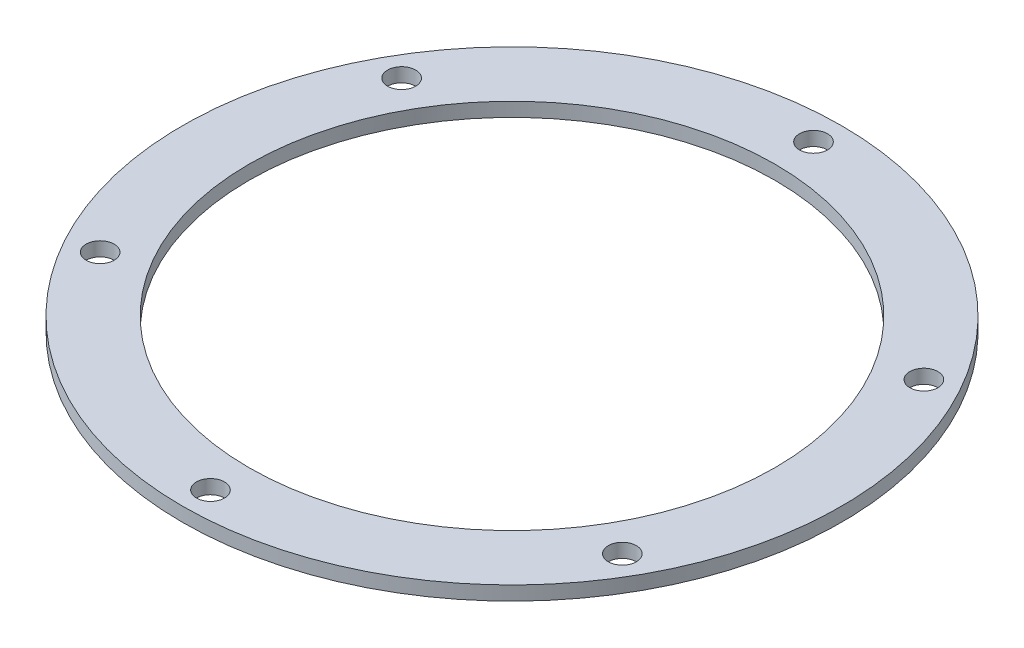
ISO-10303-21;
HEADER;
FILE_DESCRIPTION(('STEP AP214'),'2;1');
FILE_NAME('part.step','',(''),(''),'','','');
FILE_SCHEMA(('AUTOMOTIVE_DESIGN { 1 0 10303 214 1 1 1 1 }'));
ENDSEC;
DATA;
#1=APPLICATION_CONTEXT('core data for automotive mechanical design processes');
#2=APPLICATION_PROTOCOL_DEFINITION('international standard','automotive_design',2000,#1);
#3=PRODUCT_CONTEXT('',#1,'mechanical');
#4=PRODUCT('Part','Part','',(#3));
#5=PRODUCT_RELATED_PRODUCT_CATEGORY('part','',(#4));
#6=PRODUCT_DEFINITION_FORMATION('','',#4);
#7=PRODUCT_DEFINITION_CONTEXT('part definition',#1,'design');
#8=PRODUCT_DEFINITION('design','',#6,#7);
#9=PRODUCT_DEFINITION_SHAPE('','',#8);
#10=(LENGTH_UNIT() NAMED_UNIT(*) SI_UNIT(.MILLI.,.METRE.));
#11=(NAMED_UNIT(*) PLANE_ANGLE_UNIT() SI_UNIT($,.RADIAN.));
#12=(NAMED_UNIT(*) SI_UNIT($,.STERADIAN.) SOLID_ANGLE_UNIT());
#13=UNCERTAINTY_MEASURE_WITH_UNIT(LENGTH_MEASURE(1.E-05),#10,'distance_accuracy_value','');
#14=(GEOMETRIC_REPRESENTATION_CONTEXT(3) GLOBAL_UNCERTAINTY_ASSIGNED_CONTEXT((#13)) GLOBAL_UNIT_ASSIGNED_CONTEXT((#10,
#11,#12)) REPRESENTATION_CONTEXT('',''));
#15=CARTESIAN_POINT('',(0.,0.,0.));
#16=DIRECTION('',(0.,0.,1.));
#17=DIRECTION('',(1.,0.,0.));
#18=AXIS2_PLACEMENT_3D('',#15,#16,#17);
#19=CARTESIAN_POINT('',(0.,2.,0.));
#20=DIRECTION('',(0.,1.,0.));
#21=DIRECTION('',(0.,0.,1.));
#22=AXIS2_PLACEMENT_3D('',#19,#20,#21);
#23=PLANE('',#22);
#24=CARTESIAN_POINT('',(-37.2390923627309,2.,21.5));
#25=DIRECTION('',(0.,1.,0.));
#26=DIRECTION('',(0.,0.,1.));
#27=AXIS2_PLACEMENT_3D('',#24,#25,#26);
#28=CIRCLE('',#27,2.);
#29=CARTESIAN_POINT('',(-37.2390923627309,2.,23.5));
#30=VERTEX_POINT('',#29);
#31=EDGE_CURVE('E80',#30,#30,#28,.T.);
#32=ORIENTED_EDGE('',*,*,#31,.F.);
#33=EDGE_LOOP('',(#32));
#34=FACE_BOUND('',#33,.T.);
#35=CARTESIAN_POINT('',(37.2390923627309,2.,21.5));
#36=DIRECTION('',(0.,1.,0.));
#37=DIRECTION('',(0.,0.,1.));
#38=AXIS2_PLACEMENT_3D('',#35,#36,#37);
#39=CIRCLE('',#38,2.);
#40=CARTESIAN_POINT('',(37.2390923627309,2.,23.5));
#41=VERTEX_POINT('',#40);
#42=EDGE_CURVE('E62',#41,#41,#39,.T.);
#43=ORIENTED_EDGE('',*,*,#42,.F.);
#44=EDGE_LOOP('',(#43));
#45=FACE_BOUND('',#44,.T.);
#46=CARTESIAN_POINT('',(0.,2.,-43.));
#47=DIRECTION('',(0.,1.,0.));
#48=DIRECTION('',(0.,0.,1.));
#49=AXIS2_PLACEMENT_3D('',#46,#47,#48);
#50=CIRCLE('',#49,2.);
#51=CARTESIAN_POINT('',(0.,2.,-41.));
#52=VERTEX_POINT('',#51);
#53=EDGE_CURVE('E52',#52,#52,#50,.T.);
#54=ORIENTED_EDGE('',*,*,#53,.F.);
#55=EDGE_LOOP('',(#54));
#56=FACE_BOUND('',#55,.T.);
#57=CARTESIAN_POINT('',(0.,2.,0.));
#58=DIRECTION('',(0.,1.,0.));
#59=DIRECTION('',(0.,0.,1.));
#60=AXIS2_PLACEMENT_3D('',#57,#58,#59);
#61=CIRCLE('',#60,47.);
#62=CARTESIAN_POINT('',(0.,2.,47.));
#63=VERTEX_POINT('',#62);
#64=EDGE_CURVE('E10',#63,#63,#61,.T.);
#65=ORIENTED_EDGE('',*,*,#64,.T.);
#66=EDGE_LOOP('',(#65));
#67=FACE_BOUND('',#66,.T.);
#68=CARTESIAN_POINT('',(0.,2.,0.));
#69=DIRECTION('',(0.,1.,0.));
#70=DIRECTION('',(0.,0.,1.));
#71=AXIS2_PLACEMENT_3D('',#68,#69,#70);
#72=CIRCLE('',#71,37.5);
#73=CARTESIAN_POINT('',(0.,2.,37.5));
#74=VERTEX_POINT('',#73);
#75=EDGE_CURVE('E48',#74,#74,#72,.T.);
#76=ORIENTED_EDGE('',*,*,#75,.F.);
#77=EDGE_LOOP('',(#76));
#78=FACE_BOUND('',#77,.T.);
#79=CARTESIAN_POINT('',(37.2390923627309,2.,-21.5));
#80=DIRECTION('',(0.,1.,0.));
#81=DIRECTION('',(0.,0.,1.));
#82=AXIS2_PLACEMENT_3D('',#79,#80,#81);
#83=CIRCLE('',#82,2.);
#84=CARTESIAN_POINT('',(37.2390923627309,2.,-19.5));
#85=VERTEX_POINT('',#84);
#86=EDGE_CURVE('E56',#85,#85,#83,.T.);
#87=ORIENTED_EDGE('',*,*,#86,.F.);
#88=EDGE_LOOP('',(#87));
#89=FACE_BOUND('',#88,.T.);
#90=CARTESIAN_POINT('',(0.,2.,43.));
#91=DIRECTION('',(0.,1.,0.));
#92=DIRECTION('',(0.,0.,1.));
#93=AXIS2_PLACEMENT_3D('',#90,#91,#92);
#94=CIRCLE('',#93,2.00000000000001);
#95=CARTESIAN_POINT('',(0.,2.,45.));
#96=VERTEX_POINT('',#95);
#97=EDGE_CURVE('E72',#96,#96,#94,.T.);
#98=ORIENTED_EDGE('',*,*,#97,.F.);
#99=EDGE_LOOP('',(#98));
#100=FACE_BOUND('',#99,.T.);
#101=CARTESIAN_POINT('',(-37.2390923627309,2.,-21.5));
#102=DIRECTION('',(0.,1.,0.));
#103=DIRECTION('',(0.,0.,1.));
#104=AXIS2_PLACEMENT_3D('',#101,#102,#103);
#105=CIRCLE('',#104,2.);
#106=CARTESIAN_POINT('',(-37.2390923627309,2.,-19.5));
#107=VERTEX_POINT('',#106);
#108=EDGE_CURVE('E83',#107,#107,#105,.T.);
#109=ORIENTED_EDGE('',*,*,#108,.F.);
#110=EDGE_LOOP('',(#109));
#111=FACE_BOUND('',#110,.T.);
#112=ADVANCED_FACE('F40',(#34,#45,#56,#67,#78,#89,#100,#111),#23,.T.);
#113=CARTESIAN_POINT('',(0.,0.,0.));
#114=DIRECTION('',(0.,1.,0.));
#115=DIRECTION('',(0.,0.,1.));
#116=AXIS2_PLACEMENT_3D('',#113,#114,#115);
#117=PLANE('',#116);
#118=CARTESIAN_POINT('',(0.,0.,0.));
#119=DIRECTION('',(0.,1.,0.));
#120=DIRECTION('',(0.,0.,1.));
#121=AXIS2_PLACEMENT_3D('',#118,#119,#120);
#122=CIRCLE('',#121,47.);
#123=CARTESIAN_POINT('',(0.,0.,47.));
#124=VERTEX_POINT('',#123);
#125=EDGE_CURVE('E41',#124,#124,#122,.T.);
#126=ORIENTED_EDGE('',*,*,#125,.F.);
#127=EDGE_LOOP('',(#126));
#128=FACE_BOUND('',#127,.T.);
#129=CARTESIAN_POINT('',(0.,0.,0.));
#130=DIRECTION('',(0.,1.,0.));
#131=DIRECTION('',(0.,0.,1.));
#132=AXIS2_PLACEMENT_3D('',#129,#130,#131);
#133=CIRCLE('',#132,37.5);
#134=CARTESIAN_POINT('',(0.,0.,37.5));
#135=VERTEX_POINT('',#134);
#136=EDGE_CURVE('E49',#135,#135,#133,.T.);
#137=ORIENTED_EDGE('',*,*,#136,.T.);
#138=EDGE_LOOP('',(#137));
#139=FACE_BOUND('',#138,.T.);
#140=CARTESIAN_POINT('',(0.,0.,-43.));
#141=DIRECTION('',(0.,1.,0.));
#142=DIRECTION('',(0.,0.,1.));
#143=AXIS2_PLACEMENT_3D('',#140,#141,#142);
#144=CIRCLE('',#143,2.);
#145=CARTESIAN_POINT('',(0.,0.,-41.));
#146=VERTEX_POINT('',#145);
#147=EDGE_CURVE('E57',#146,#146,#144,.T.);
#148=ORIENTED_EDGE('',*,*,#147,.T.);
#149=EDGE_LOOP('',(#148));
#150=FACE_BOUND('',#149,.T.);
#151=CARTESIAN_POINT('',(37.2390923627309,0.,-21.5));
#152=DIRECTION('',(0.,1.,0.));
#153=DIRECTION('',(0.,0.,1.));
#154=AXIS2_PLACEMENT_3D('',#151,#152,#153);
#155=CIRCLE('',#154,2.);
#156=CARTESIAN_POINT('',(37.2390923627309,0.,-19.5));
#157=VERTEX_POINT('',#156);
#158=EDGE_CURVE('E65',#157,#157,#155,.T.);
#159=ORIENTED_EDGE('',*,*,#158,.T.);
#160=EDGE_LOOP('',(#159));
#161=FACE_BOUND('',#160,.T.);
#162=CARTESIAN_POINT('',(37.2390923627309,0.,21.5));
#163=DIRECTION('',(0.,1.,0.));
#164=DIRECTION('',(0.,0.,1.));
#165=AXIS2_PLACEMENT_3D('',#162,#163,#164);
#166=CIRCLE('',#165,2.);
#167=CARTESIAN_POINT('',(37.2390923627309,0.,23.5));
#168=VERTEX_POINT('',#167);
#169=EDGE_CURVE('E68',#168,#168,#166,.T.);
#170=ORIENTED_EDGE('',*,*,#169,.T.);
#171=EDGE_LOOP('',(#170));
#172=FACE_BOUND('',#171,.T.);
#173=CARTESIAN_POINT('',(0.,0.,43.));
#174=DIRECTION('',(0.,1.,0.));
#175=DIRECTION('',(0.,0.,1.));
#176=AXIS2_PLACEMENT_3D('',#173,#174,#175);
#177=CIRCLE('',#176,2.00000000000001);
#178=CARTESIAN_POINT('',(0.,0.,45.));
#179=VERTEX_POINT('',#178);
#180=EDGE_CURVE('E74',#179,#179,#177,.T.);
#181=ORIENTED_EDGE('',*,*,#180,.T.);
#182=EDGE_LOOP('',(#181));
#183=FACE_BOUND('',#182,.T.);
#184=CARTESIAN_POINT('',(-37.2390923627309,0.,21.5));
#185=DIRECTION('',(0.,1.,0.));
#186=DIRECTION('',(0.,0.,1.));
#187=AXIS2_PLACEMENT_3D('',#184,#185,#186);
#188=CIRCLE('',#187,2.);
#189=CARTESIAN_POINT('',(-37.2390923627309,0.,23.5));
#190=VERTEX_POINT('',#189);
#191=EDGE_CURVE('E77',#190,#190,#188,.T.);
#192=ORIENTED_EDGE('',*,*,#191,.T.);
#193=EDGE_LOOP('',(#192));
#194=FACE_BOUND('',#193,.T.);
#195=CARTESIAN_POINT('',(-37.2390923627309,0.,-21.5));
#196=DIRECTION('',(0.,1.,0.));
#197=DIRECTION('',(0.,0.,1.));
#198=AXIS2_PLACEMENT_3D('',#195,#196,#197);
#199=CIRCLE('',#198,2.);
#200=CARTESIAN_POINT('',(-37.2390923627309,0.,-19.5));
#201=VERTEX_POINT('',#200);
#202=EDGE_CURVE('E88',#201,#201,#199,.T.);
#203=ORIENTED_EDGE('',*,*,#202,.T.);
#204=EDGE_LOOP('',(#203));
#205=FACE_BOUND('',#204,.T.);
#206=ADVANCED_FACE('F96',(#128,#139,#150,#161,#172,#183,#194,#205),#117,.F.);
#207=CARTESIAN_POINT('',(0.,2.,0.));
#208=DIRECTION('',(0.,-1.,0.));
#209=DIRECTION('',(0.,0.,-1.));
#210=AXIS2_PLACEMENT_3D('',#207,#208,#209);
#211=CYLINDRICAL_SURFACE('',#210,47.);
#212=ORIENTED_EDGE('',*,*,#64,.F.);
#213=EDGE_LOOP('',(#212));
#214=FACE_BOUND('',#213,.T.);
#215=ORIENTED_EDGE('',*,*,#125,.T.);
#216=EDGE_LOOP('',(#215));
#217=FACE_BOUND('',#216,.T.);
#218=ADVANCED_FACE('F39',(#214,#217),#211,.T.);
#219=CARTESIAN_POINT('',(0.,2.,0.));
#220=DIRECTION('',(0.,-1.,0.));
#221=DIRECTION('',(0.,0.,-1.));
#222=AXIS2_PLACEMENT_3D('',#219,#220,#221);
#223=CYLINDRICAL_SURFACE('',#222,37.5);
#224=ORIENTED_EDGE('',*,*,#75,.T.);
#225=EDGE_LOOP('',(#224));
#226=FACE_BOUND('',#225,.T.);
#227=ORIENTED_EDGE('',*,*,#136,.F.);
#228=EDGE_LOOP('',(#227));
#229=FACE_BOUND('',#228,.T.);
#230=ADVANCED_FACE('F106',(#226,#229),#223,.F.);
#231=CARTESIAN_POINT('',(0.,2.,-43.));
#232=DIRECTION('',(0.,-1.,0.));
#233=DIRECTION('',(0.,0.,-1.));
#234=AXIS2_PLACEMENT_3D('',#231,#232,#233);
#235=CYLINDRICAL_SURFACE('',#234,2.);
#236=ORIENTED_EDGE('',*,*,#53,.T.);
#237=EDGE_LOOP('',(#236));
#238=FACE_BOUND('',#237,.T.);
#239=ORIENTED_EDGE('',*,*,#147,.F.);
#240=EDGE_LOOP('',(#239));
#241=FACE_BOUND('',#240,.T.);
#242=ADVANCED_FACE('F108',(#238,#241),#235,.F.);
#243=CARTESIAN_POINT('',(37.2390923627309,2.,-21.5));
#244=DIRECTION('',(0.,-1.,0.));
#245=DIRECTION('',(0.,0.,-1.));
#246=AXIS2_PLACEMENT_3D('',#243,#244,#245);
#247=CYLINDRICAL_SURFACE('',#246,2.);
#248=ORIENTED_EDGE('',*,*,#86,.T.);
#249=EDGE_LOOP('',(#248));
#250=FACE_BOUND('',#249,.T.);
#251=ORIENTED_EDGE('',*,*,#158,.F.);
#252=EDGE_LOOP('',(#251));
#253=FACE_BOUND('',#252,.T.);
#254=ADVANCED_FACE('F114',(#250,#253),#247,.F.);
#255=CARTESIAN_POINT('',(37.2390923627309,2.,21.5));
#256=DIRECTION('',(0.,-1.,0.));
#257=DIRECTION('',(0.,0.,-1.));
#258=AXIS2_PLACEMENT_3D('',#255,#256,#257);
#259=CYLINDRICAL_SURFACE('',#258,2.);
#260=ORIENTED_EDGE('',*,*,#42,.T.);
#261=EDGE_LOOP('',(#260));
#262=FACE_BOUND('',#261,.T.);
#263=ORIENTED_EDGE('',*,*,#169,.F.);
#264=EDGE_LOOP('',(#263));
#265=FACE_BOUND('',#264,.T.);
#266=ADVANCED_FACE('F120',(#262,#265),#259,.F.);
#267=CARTESIAN_POINT('',(0.,2.,43.));
#268=DIRECTION('',(0.,-1.,0.));
#269=DIRECTION('',(0.,0.,-1.));
#270=AXIS2_PLACEMENT_3D('',#267,#268,#269);
#271=CYLINDRICAL_SURFACE('',#270,2.00000000000001);
#272=ORIENTED_EDGE('',*,*,#97,.T.);
#273=EDGE_LOOP('',(#272));
#274=FACE_BOUND('',#273,.T.);
#275=ORIENTED_EDGE('',*,*,#180,.F.);
#276=EDGE_LOOP('',(#275));
#277=FACE_BOUND('',#276,.T.);
#278=ADVANCED_FACE('F121',(#274,#277),#271,.F.);
#279=CARTESIAN_POINT('',(-37.2390923627309,2.,21.5));
#280=DIRECTION('',(0.,-1.,0.));
#281=DIRECTION('',(0.,0.,-1.));
#282=AXIS2_PLACEMENT_3D('',#279,#280,#281);
#283=CYLINDRICAL_SURFACE('',#282,2.);
#284=ORIENTED_EDGE('',*,*,#31,.T.);
#285=EDGE_LOOP('',(#284));
#286=FACE_BOUND('',#285,.T.);
#287=ORIENTED_EDGE('',*,*,#191,.F.);
#288=EDGE_LOOP('',(#287));
#289=FACE_BOUND('',#288,.T.);
#290=ADVANCED_FACE('F124',(#286,#289),#283,.F.);
#291=CARTESIAN_POINT('',(-37.2390923627309,2.,-21.5));
#292=DIRECTION('',(0.,-1.,0.));
#293=DIRECTION('',(0.,0.,-1.));
#294=AXIS2_PLACEMENT_3D('',#291,#292,#293);
#295=CYLINDRICAL_SURFACE('',#294,2.);
#296=ORIENTED_EDGE('',*,*,#108,.T.);
#297=EDGE_LOOP('',(#296));
#298=FACE_BOUND('',#297,.T.);
#299=ORIENTED_EDGE('',*,*,#202,.F.);
#300=EDGE_LOOP('',(#299));
#301=FACE_BOUND('',#300,.T.);
#302=ADVANCED_FACE('F95',(#298,#301),#295,.F.);
#303=CLOSED_SHELL('',(#112,#206,#218,#230,#242,#254,#266,#278,#290,#302));
#304=MANIFOLD_SOLID_BREP('B2',#303);
#305=ADVANCED_BREP_SHAPE_REPRESENTATION('',(#18,#304),#14);
#306=SHAPE_DEFINITION_REPRESENTATION(#9,#305);
ENDSEC;
END-ISO-10303-21;
